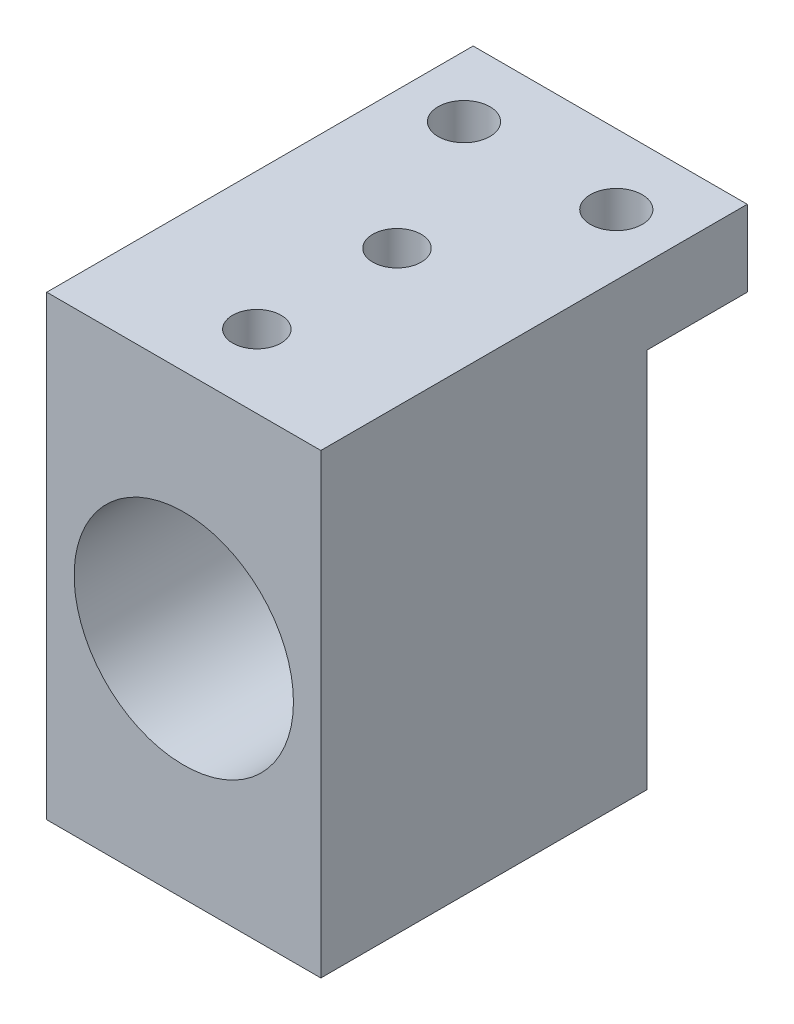
ISO-10303-21;
HEADER;
FILE_DESCRIPTION(('STEP AP214'),'2;1');
FILE_NAME('part.step','',(''),(''),'','','');
FILE_SCHEMA(('AUTOMOTIVE_DESIGN { 1 0 10303 214 1 1 1 1 }'));
ENDSEC;
DATA;
#1=APPLICATION_CONTEXT('core data for automotive mechanical design processes');
#2=APPLICATION_PROTOCOL_DEFINITION('international standard','automotive_design',2000,#1);
#3=PRODUCT_CONTEXT('',#1,'mechanical');
#4=PRODUCT('Part','Part','',(#3));
#5=PRODUCT_RELATED_PRODUCT_CATEGORY('part','',(#4));
#6=PRODUCT_DEFINITION_FORMATION('','',#4);
#7=PRODUCT_DEFINITION_CONTEXT('part definition',#1,'design');
#8=PRODUCT_DEFINITION('design','',#6,#7);
#9=PRODUCT_DEFINITION_SHAPE('','',#8);
#10=(LENGTH_UNIT() NAMED_UNIT(*) SI_UNIT(.MILLI.,.METRE.));
#11=(NAMED_UNIT(*) PLANE_ANGLE_UNIT() SI_UNIT($,.RADIAN.));
#12=(NAMED_UNIT(*) SI_UNIT($,.STERADIAN.) SOLID_ANGLE_UNIT());
#13=UNCERTAINTY_MEASURE_WITH_UNIT(LENGTH_MEASURE(1.E-05),#10,'distance_accuracy_value','');
#14=(GEOMETRIC_REPRESENTATION_CONTEXT(3) GLOBAL_UNCERTAINTY_ASSIGNED_CONTEXT((#13)) GLOBAL_UNIT_ASSIGNED_CONTEXT((#10,
#11,#12)) REPRESENTATION_CONTEXT('',''));
#15=CARTESIAN_POINT('',(0.,0.,0.));
#16=DIRECTION('',(0.,0.,1.));
#17=DIRECTION('',(1.,0.,0.));
#18=AXIS2_PLACEMENT_3D('',#15,#16,#17);
#19=CARTESIAN_POINT('',(-11.43,38.1,17.78));
#20=DIRECTION('',(1.,0.,0.));
#21=DIRECTION('',(0.,0.,-1.));
#22=AXIS2_PLACEMENT_3D('',#19,#20,#21);
#23=PLANE('',#22);
#24=DIRECTION('',(0.,0.,-1.));
#25=VECTOR('',#24,1.);
#26=CARTESIAN_POINT('',(-11.43,31.75,-17.78));
#27=LINE('',#26,#25);
#28=CARTESIAN_POINT('',(-11.43,31.75,-9.398));
#29=VERTEX_POINT('',#28);
#30=CARTESIAN_POINT('',(-11.43,31.75,-17.78));
#31=VERTEX_POINT('',#30);
#32=EDGE_CURVE('E97',#29,#31,#27,.T.);
#33=ORIENTED_EDGE('',*,*,#32,.F.);
#34=DIRECTION('',(0.,-1.,0.));
#35=VECTOR('',#34,1.);
#36=CARTESIAN_POINT('',(-11.43,31.75,-9.398));
#37=LINE('',#36,#35);
#38=CARTESIAN_POINT('',(-11.43,0.,-9.398));
#39=VERTEX_POINT('',#38);
#40=EDGE_CURVE('E137',#29,#39,#37,.T.);
#41=ORIENTED_EDGE('',*,*,#40,.T.);
#42=DIRECTION('',(0.,0.,1.));
#43=VECTOR('',#42,1.);
#44=CARTESIAN_POINT('',(-11.43,0.,17.78));
#45=LINE('',#44,#43);
#46=CARTESIAN_POINT('',(-11.43,0.,17.78));
#47=VERTEX_POINT('',#46);
#48=EDGE_CURVE('E136',#39,#47,#45,.T.);
#49=ORIENTED_EDGE('',*,*,#48,.T.);
#50=DIRECTION('',(0.,-1.,0.));
#51=VECTOR('',#50,1.);
#52=CARTESIAN_POINT('',(-11.43,38.1,17.78));
#53=LINE('',#52,#51);
#54=CARTESIAN_POINT('',(-11.43,38.1,17.78));
#55=VERTEX_POINT('',#54);
#56=EDGE_CURVE('E11',#55,#47,#53,.T.);
#57=ORIENTED_EDGE('',*,*,#56,.F.);
#58=DIRECTION('',(0.,0.,1.));
#59=VECTOR('',#58,1.);
#60=CARTESIAN_POINT('',(-11.43,38.1,17.78));
#61=LINE('',#60,#59);
#62=CARTESIAN_POINT('',(-11.43,38.1,-17.78));
#63=VERTEX_POINT('',#62);
#64=EDGE_CURVE('E118',#63,#55,#61,.T.);
#65=ORIENTED_EDGE('',*,*,#64,.F.);
#66=DIRECTION('',(0.,-1.,0.));
#67=VECTOR('',#66,1.);
#68=CARTESIAN_POINT('',(-11.43,38.1,-17.78));
#69=LINE('',#68,#67);
#70=EDGE_CURVE('E111',#63,#31,#69,.T.);
#71=ORIENTED_EDGE('',*,*,#70,.T.);
#72=EDGE_LOOP('',(#33,#41,#49,#57,#65,#71));
#73=FACE_BOUND('',#72,.T.);
#74=ADVANCED_FACE('F36',(#73),#23,.F.);
#75=CARTESIAN_POINT('',(11.43,38.1,17.78));
#76=DIRECTION('',(0.,0.,-1.));
#77=DIRECTION('',(-1.,0.,0.));
#78=AXIS2_PLACEMENT_3D('',#75,#76,#77);
#79=PLANE('',#78);
#80=CARTESIAN_POINT('',(0.,18.796,17.78));
#81=DIRECTION('',(0.,0.,1.));
#82=DIRECTION('',(1.,0.,0.));
#83=AXIS2_PLACEMENT_3D('',#80,#81,#82);
#84=CIRCLE('',#83,9.144);
#85=CARTESIAN_POINT('',(9.144,18.796,17.78));
#86=VERTEX_POINT('',#85);
#87=EDGE_CURVE('E159',#86,#86,#84,.T.);
#88=ORIENTED_EDGE('',*,*,#87,.F.);
#89=EDGE_LOOP('',(#88));
#90=FACE_BOUND('',#89,.T.);
#91=DIRECTION('',(1.,0.,0.));
#92=VECTOR('',#91,1.);
#93=CARTESIAN_POINT('',(11.43,0.,17.78));
#94=LINE('',#93,#92);
#95=CARTESIAN_POINT('',(11.43,0.,17.78));
#96=VERTEX_POINT('',#95);
#97=EDGE_CURVE('E75',#47,#96,#94,.T.);
#98=ORIENTED_EDGE('',*,*,#97,.T.);
#99=DIRECTION('',(0.,-1.,0.));
#100=VECTOR('',#99,1.);
#101=CARTESIAN_POINT('',(11.43,38.1,17.78));
#102=LINE('',#101,#100);
#103=CARTESIAN_POINT('',(11.43,38.1,17.78));
#104=VERTEX_POINT('',#103);
#105=EDGE_CURVE('E44',#104,#96,#102,.T.);
#106=ORIENTED_EDGE('',*,*,#105,.F.);
#107=DIRECTION('',(1.,0.,0.));
#108=VECTOR('',#107,1.);
#109=CARTESIAN_POINT('',(11.43,38.1,17.78));
#110=LINE('',#109,#108);
#111=EDGE_CURVE('E80',#55,#104,#110,.T.);
#112=ORIENTED_EDGE('',*,*,#111,.F.);
#113=ORIENTED_EDGE('',*,*,#56,.T.);
#114=EDGE_LOOP('',(#98,#106,#112,#113));
#115=FACE_BOUND('',#114,.T.);
#116=ADVANCED_FACE('F205',(#90,#115),#79,.F.);
#117=CARTESIAN_POINT('',(11.43,38.1,17.78));
#118=DIRECTION('',(-1.,0.,0.));
#119=DIRECTION('',(0.,0.,1.));
#120=AXIS2_PLACEMENT_3D('',#117,#118,#119);
#121=PLANE('',#120);
#122=DIRECTION('',(0.,0.,-1.));
#123=VECTOR('',#122,1.);
#124=CARTESIAN_POINT('',(11.43,0.,17.78));
#125=LINE('',#124,#123);
#126=CARTESIAN_POINT('',(11.43,0.,-9.39799999999999));
#127=VERTEX_POINT('',#126);
#128=EDGE_CURVE('E124',#96,#127,#125,.T.);
#129=ORIENTED_EDGE('',*,*,#128,.T.);
#130=DIRECTION('',(0.,-1.,0.));
#131=VECTOR('',#130,1.);
#132=CARTESIAN_POINT('',(11.43,31.75,-9.39799999999999));
#133=LINE('',#132,#131);
#134=CARTESIAN_POINT('',(11.43,31.75,-9.39799999999999));
#135=VERTEX_POINT('',#134);
#136=EDGE_CURVE('E51',#135,#127,#133,.T.);
#137=ORIENTED_EDGE('',*,*,#136,.F.);
#138=DIRECTION('',(0.,0.,1.));
#139=VECTOR('',#138,1.);
#140=CARTESIAN_POINT('',(11.43,31.75,-17.78));
#141=LINE('',#140,#139);
#142=CARTESIAN_POINT('',(11.43,31.75,-17.78));
#143=VERTEX_POINT('',#142);
#144=EDGE_CURVE('E115',#143,#135,#141,.T.);
#145=ORIENTED_EDGE('',*,*,#144,.F.);
#146=DIRECTION('',(0.,-1.,0.));
#147=VECTOR('',#146,1.);
#148=CARTESIAN_POINT('',(11.43,38.1,-17.78));
#149=LINE('',#148,#147);
#150=CARTESIAN_POINT('',(11.43,38.1,-17.78));
#151=VERTEX_POINT('',#150);
#152=EDGE_CURVE('E114',#151,#143,#149,.T.);
#153=ORIENTED_EDGE('',*,*,#152,.F.);
#154=DIRECTION('',(0.,0.,-1.));
#155=VECTOR('',#154,1.);
#156=CARTESIAN_POINT('',(11.43,38.1,17.78));
#157=LINE('',#156,#155);
#158=EDGE_CURVE('E121',#104,#151,#157,.T.);
#159=ORIENTED_EDGE('',*,*,#158,.F.);
#160=ORIENTED_EDGE('',*,*,#105,.T.);
#161=EDGE_LOOP('',(#129,#137,#145,#153,#159,#160));
#162=FACE_BOUND('',#161,.T.);
#163=ADVANCED_FACE('F131',(#162),#121,.F.);
#164=CARTESIAN_POINT('',(11.43,38.1,-17.78));
#165=DIRECTION('',(0.,0.,1.));
#166=DIRECTION('',(1.,0.,0.));
#167=AXIS2_PLACEMENT_3D('',#164,#165,#166);
#168=PLANE('',#167);
#169=ORIENTED_EDGE('',*,*,#152,.T.);
#170=DIRECTION('',(1.,0.,0.));
#171=VECTOR('',#170,1.);
#172=CARTESIAN_POINT('',(-11.43,31.75,-17.78));
#173=LINE('',#172,#171);
#174=EDGE_CURVE('E100',#31,#143,#173,.T.);
#175=ORIENTED_EDGE('',*,*,#174,.F.);
#176=ORIENTED_EDGE('',*,*,#70,.F.);
#177=DIRECTION('',(-1.,0.,0.));
#178=VECTOR('',#177,1.);
#179=CARTESIAN_POINT('',(11.43,38.1,-17.78));
#180=LINE('',#179,#178);
#181=EDGE_CURVE('E60',#151,#63,#180,.T.);
#182=ORIENTED_EDGE('',*,*,#181,.F.);
#183=EDGE_LOOP('',(#169,#175,#176,#182));
#184=FACE_BOUND('',#183,.T.);
#185=ADVANCED_FACE('F110',(#184),#168,.F.);
#186=CARTESIAN_POINT('',(0.,38.1,0.));
#187=DIRECTION('',(0.,1.,0.));
#188=DIRECTION('',(0.,0.,1.));
#189=AXIS2_PLACEMENT_3D('',#186,#187,#188);
#190=PLANE('',#189);
#191=CARTESIAN_POINT('',(0.,38.1,0.));
#192=DIRECTION('',(0.,1.,0.));
#193=DIRECTION('',(0.,0.,1.));
#194=AXIS2_PLACEMENT_3D('',#191,#192,#193);
#195=CIRCLE('',#194,2.01929999999999);
#196=CARTESIAN_POINT('',(0.,38.1,2.01929999999999));
#197=VERTEX_POINT('',#196);
#198=EDGE_CURVE('E190',#197,#197,#195,.T.);
#199=ORIENTED_EDGE('',*,*,#198,.F.);
#200=EDGE_LOOP('',(#199));
#201=FACE_BOUND('',#200,.T.);
#202=CARTESIAN_POINT('',(0.,38.1,11.6894741905998));
#203=DIRECTION('',(0.,1.,0.));
#204=DIRECTION('',(0.,0.,1.));
#205=AXIS2_PLACEMENT_3D('',#202,#203,#204);
#206=CIRCLE('',#205,2.01929999999999);
#207=CARTESIAN_POINT('',(0.,38.1,13.7087741905998));
#208=VERTEX_POINT('',#207);
#209=EDGE_CURVE('E170',#208,#208,#206,.T.);
#210=ORIENTED_EDGE('',*,*,#209,.F.);
#211=EDGE_LOOP('',(#210));
#212=FACE_BOUND('',#211,.T.);
#213=CARTESIAN_POINT('',(-6.35,38.1,-11.938));
#214=DIRECTION('',(0.,1.,0.));
#215=DIRECTION('',(0.,0.,1.));
#216=AXIS2_PLACEMENT_3D('',#213,#214,#215);
#217=CIRCLE('',#216,2.159);
#218=CARTESIAN_POINT('',(-6.35,38.1,-9.779));
#219=VERTEX_POINT('',#218);
#220=EDGE_CURVE('E154',#219,#219,#217,.T.);
#221=ORIENTED_EDGE('',*,*,#220,.F.);
#222=EDGE_LOOP('',(#221));
#223=FACE_BOUND('',#222,.T.);
#224=CARTESIAN_POINT('',(6.35,38.1,-11.938));
#225=DIRECTION('',(0.,1.,0.));
#226=DIRECTION('',(0.,0.,-1.));
#227=AXIS2_PLACEMENT_3D('',#224,#225,#226);
#228=CIRCLE('',#227,2.159);
#229=CARTESIAN_POINT('',(6.35,38.1,-14.097));
#230=VERTEX_POINT('',#229);
#231=EDGE_CURVE('E148',#230,#230,#228,.T.);
#232=ORIENTED_EDGE('',*,*,#231,.F.);
#233=EDGE_LOOP('',(#232));
#234=FACE_BOUND('',#233,.T.);
#235=ORIENTED_EDGE('',*,*,#64,.T.);
#236=ORIENTED_EDGE('',*,*,#111,.T.);
#237=ORIENTED_EDGE('',*,*,#158,.T.);
#238=ORIENTED_EDGE('',*,*,#181,.T.);
#239=EDGE_LOOP('',(#235,#236,#237,#238));
#240=FACE_BOUND('',#239,.T.);
#241=ADVANCED_FACE('F195',(#201,#212,#223,#234,#240),#190,.T.);
#242=CARTESIAN_POINT('',(0.,0.,0.));
#243=DIRECTION('',(0.,1.,0.));
#244=DIRECTION('',(0.,0.,1.));
#245=AXIS2_PLACEMENT_3D('',#242,#243,#244);
#246=PLANE('',#245);
#247=ORIENTED_EDGE('',*,*,#48,.F.);
#248=DIRECTION('',(-1.,0.,0.));
#249=VECTOR('',#248,1.);
#250=CARTESIAN_POINT('',(-11.43,0.,-9.398));
#251=LINE('',#250,#249);
#252=EDGE_CURVE('E106',#127,#39,#251,.T.);
#253=ORIENTED_EDGE('',*,*,#252,.F.);
#254=ORIENTED_EDGE('',*,*,#128,.F.);
#255=ORIENTED_EDGE('',*,*,#97,.F.);
#256=EDGE_LOOP('',(#247,#253,#254,#255));
#257=FACE_BOUND('',#256,.T.);
#258=ADVANCED_FACE('F134',(#257),#246,.F.);
#259=CARTESIAN_POINT('',(-11.43,31.75,-9.398));
#260=DIRECTION('',(0.,0.,1.));
#261=DIRECTION('',(1.,0.,0.));
#262=AXIS2_PLACEMENT_3D('',#259,#260,#261);
#263=PLANE('',#262);
#264=CARTESIAN_POINT('',(0.,18.796,-9.39799999999999));
#265=DIRECTION('',(0.,0.,1.));
#266=DIRECTION('',(1.,0.,0.));
#267=AXIS2_PLACEMENT_3D('',#264,#265,#266);
#268=CIRCLE('',#267,9.144);
#269=CARTESIAN_POINT('',(9.144,18.796,-9.39799999999999));
#270=VERTEX_POINT('',#269);
#271=EDGE_CURVE('E39',#270,#270,#268,.T.);
#272=ORIENTED_EDGE('',*,*,#271,.T.);
#273=EDGE_LOOP('',(#272));
#274=FACE_BOUND('',#273,.T.);
#275=ORIENTED_EDGE('',*,*,#252,.T.);
#276=ORIENTED_EDGE('',*,*,#40,.F.);
#277=DIRECTION('',(-1.,0.,0.));
#278=VECTOR('',#277,1.);
#279=CARTESIAN_POINT('',(-11.43,31.75,-9.398));
#280=LINE('',#279,#278);
#281=EDGE_CURVE('E102',#135,#29,#280,.T.);
#282=ORIENTED_EDGE('',*,*,#281,.F.);
#283=ORIENTED_EDGE('',*,*,#136,.T.);
#284=EDGE_LOOP('',(#275,#276,#282,#283));
#285=FACE_BOUND('',#284,.T.);
#286=ADVANCED_FACE('F218',(#274,#285),#263,.F.);
#287=CARTESIAN_POINT('',(0.,31.75,0.));
#288=DIRECTION('',(0.,1.,0.));
#289=DIRECTION('',(0.,0.,1.));
#290=AXIS2_PLACEMENT_3D('',#287,#288,#289);
#291=PLANE('',#290);
#292=CARTESIAN_POINT('',(-6.35,31.75,-11.938));
#293=DIRECTION('',(0.,1.,0.));
#294=DIRECTION('',(0.,0.,1.));
#295=AXIS2_PLACEMENT_3D('',#292,#293,#294);
#296=CIRCLE('',#295,2.159);
#297=CARTESIAN_POINT('',(-6.35,31.75,-9.779));
#298=VERTEX_POINT('',#297);
#299=EDGE_CURVE('E145',#298,#298,#296,.T.);
#300=ORIENTED_EDGE('',*,*,#299,.T.);
#301=EDGE_LOOP('',(#300));
#302=FACE_BOUND('',#301,.T.);
#303=CARTESIAN_POINT('',(6.35,31.75,-11.938));
#304=DIRECTION('',(0.,1.,0.));
#305=DIRECTION('',(0.,0.,-1.));
#306=AXIS2_PLACEMENT_3D('',#303,#304,#305);
#307=CIRCLE('',#306,2.159);
#308=CARTESIAN_POINT('',(6.35,31.75,-14.097));
#309=VERTEX_POINT('',#308);
#310=EDGE_CURVE('E151',#309,#309,#307,.T.);
#311=ORIENTED_EDGE('',*,*,#310,.T.);
#312=EDGE_LOOP('',(#311));
#313=FACE_BOUND('',#312,.T.);
#314=ORIENTED_EDGE('',*,*,#32,.T.);
#315=ORIENTED_EDGE('',*,*,#174,.T.);
#316=ORIENTED_EDGE('',*,*,#144,.T.);
#317=ORIENTED_EDGE('',*,*,#281,.T.);
#318=EDGE_LOOP('',(#314,#315,#316,#317));
#319=FACE_BOUND('',#318,.T.);
#320=ADVANCED_FACE('F99',(#302,#313,#319),#291,.F.);
#321=CARTESIAN_POINT('',(6.35,31.75,-11.938));
#322=DIRECTION('',(0.,1.,0.));
#323=DIRECTION('',(0.,0.,1.));
#324=AXIS2_PLACEMENT_3D('',#321,#322,#323);
#325=CYLINDRICAL_SURFACE('',#324,2.159);
#326=ORIENTED_EDGE('',*,*,#310,.F.);
#327=EDGE_LOOP('',(#326));
#328=FACE_BOUND('',#327,.T.);
#329=ORIENTED_EDGE('',*,*,#231,.T.);
#330=EDGE_LOOP('',(#329));
#331=FACE_BOUND('',#330,.T.);
#332=ADVANCED_FACE('F225',(#328,#331),#325,.F.);
#333=CARTESIAN_POINT('',(-6.35,31.75,-11.938));
#334=DIRECTION('',(0.,1.,0.));
#335=DIRECTION('',(0.,0.,1.));
#336=AXIS2_PLACEMENT_3D('',#333,#334,#335);
#337=CYLINDRICAL_SURFACE('',#336,2.159);
#338=ORIENTED_EDGE('',*,*,#299,.F.);
#339=EDGE_LOOP('',(#338));
#340=FACE_BOUND('',#339,.T.);
#341=ORIENTED_EDGE('',*,*,#220,.T.);
#342=EDGE_LOOP('',(#341));
#343=FACE_BOUND('',#342,.T.);
#344=ADVANCED_FACE('F229',(#340,#343),#337,.F.);
#345=CARTESIAN_POINT('',(0.,18.796,-17.78));
#346=DIRECTION('',(0.,0.,1.));
#347=DIRECTION('',(1.,0.,0.));
#348=AXIS2_PLACEMENT_3D('',#345,#346,#347);
#349=CYLINDRICAL_SURFACE('',#348,9.144);
#350=CARTESIAN_POINT('',(0.,27.94,2.01929999999999));
#351=CARTESIAN_POINT('',(0.111968514917693,27.9399979389035,2.01929621418386));
#352=CARTESIAN_POINT('',(0.22398254225839,27.9379225410807,2.00995572243882));
#353=CARTESIAN_POINT('',(0.444827050061163,27.9298438660368,1.97288041652883));
#354=CARTESIAN_POINT('',(0.553655229013896,27.9238378190067,1.94513263111525));
#355=CARTESIAN_POINT('',(0.76490461810418,27.9085663412848,1.87215566117278));
#356=CARTESIAN_POINT('',(0.86733245346457,27.8993043490417,1.82694491349101));
#357=CARTESIAN_POINT('',(1.06314555080707,27.8785197641214,1.72038431211964));
#358=CARTESIAN_POINT('',(1.15653101158984,27.8669972211602,1.65903481335799));
#359=CARTESIAN_POINT('',(1.33313759989042,27.8427425993395,1.52087757533875));
#360=CARTESIAN_POINT('',(1.41618984689284,27.8299952784797,1.44385661353387));
#361=CARTESIAN_POINT('',(1.56830788864068,27.8048348009282,1.27700046225541));
#362=CARTESIAN_POINT('',(1.63737241698043,27.7924216745814,1.18716411376938));
#363=CARTESIAN_POINT('',(1.76030274901305,27.7691845612409,0.995974679299958));
#364=CARTESIAN_POINT('',(1.81398818832152,27.7583800942368,0.894503038641087));
#365=CARTESIAN_POINT('',(1.9034792784355,27.7398026271193,0.683700241870185));
#366=CARTESIAN_POINT('',(1.93928711162396,27.7320292570145,0.574370046944756));
#367=CARTESIAN_POINT('',(1.99144725575846,27.7205494370761,0.352787225510583));
#368=CARTESIAN_POINT('',(2.00809887667615,27.7167804928154,0.240608363320027));
#369=CARTESIAN_POINT('',(2.02240469205696,27.7135486058908,0.014990821419608));
#370=CARTESIAN_POINT('',(2.02006126846075,27.7140851233306,-0.0984476985501769));
#371=CARTESIAN_POINT('',(1.996684252064,27.7193469871938,-0.321135037404961));
#372=CARTESIAN_POINT('',(1.97599891829067,27.7239942781141,-0.430422539832146));
#373=CARTESIAN_POINT('',(1.91707725103416,27.7368305842725,-0.643936757649846));
#374=CARTESIAN_POINT('',(1.8788399157938,27.7450198016599,-0.748163183810656));
#375=CARTESIAN_POINT('',(1.78558136533658,27.7640938227536,-0.949572796926258));
#376=CARTESIAN_POINT('',(1.73042672090788,27.7749999215968,-1.04669210154044));
#377=CARTESIAN_POINT('',(1.60499297548457,27.7982658695319,-1.23042568415152));
#378=CARTESIAN_POINT('',(1.53471177509951,27.8106259203074,-1.31703850135821));
#379=CARTESIAN_POINT('',(1.37917894519871,27.8357416178888,-1.47930496003606));
#380=CARTESIAN_POINT('',(1.29363131649125,27.8484999771909,-1.55467475051611));
#381=CARTESIAN_POINT('',(1.11096556067891,27.8727266434048,-1.69004462383783));
#382=CARTESIAN_POINT('',(1.01384721608786,27.8841949260603,-1.75004441771424));
#383=CARTESIAN_POINT('',(0.810446697472493,27.9045876386981,-1.8530433869954));
#384=CARTESIAN_POINT('',(0.704144799885901,27.9135064068416,-1.89600480504794));
#385=CARTESIAN_POINT('',(0.485589880121229,27.9277531780785,-1.96337614952729));
#386=CARTESIAN_POINT('',(0.373337743110945,27.933081713653,-1.98778882705733));
#387=CARTESIAN_POINT('',(0.148503050983134,27.9394716547134,-2.01695554185964));
#388=CARTESIAN_POINT('',(0.0359731095745489,27.9406171950715,-2.02209724352081));
#389=CARTESIAN_POINT('',(-0.188337850748175,27.9387480877108,-2.01362759173145));
#390=CARTESIAN_POINT('',(-0.300118920956252,27.9357337279133,-2.00001753615605));
#391=CARTESIAN_POINT('',(-0.518470652904948,27.9259366685216,-1.95475206261466));
#392=CARTESIAN_POINT('',(-0.625085654568677,27.9191965597761,-1.92330049497935));
#393=CARTESIAN_POINT('',(-0.831526477249874,27.9027026473288,-1.8434714728924));
#394=CARTESIAN_POINT('',(-0.931351711330755,27.8929485834908,-1.79509255738374));
#395=CARTESIAN_POINT('',(-1.12297850399816,27.871301513743,-1.68197803550924));
#396=CARTESIAN_POINT('',(-1.2146426815683,27.8593795355568,-1.61701536104969));
#397=CARTESIAN_POINT('',(-1.38590774221209,27.8347772834481,-1.47287581085458));
#398=CARTESIAN_POINT('',(-1.46550702352179,27.8220969091503,-1.39369705080116));
#399=CARTESIAN_POINT('',(-1.61191962528706,27.7971156211245,-1.2215925169085));
#400=CARTESIAN_POINT('',(-1.67846425880949,27.784826332629,-1.12843616315229));
#401=CARTESIAN_POINT('',(-1.79496594929387,27.7622906705589,-0.932042555403633));
#402=CARTESIAN_POINT('',(-1.84492372837182,27.7520442080567,-0.828805740521775));
#403=CARTESIAN_POINT('',(-1.92649307955932,27.7348533658871,-0.615737674013818));
#404=CARTESIAN_POINT('',(-1.95820850910044,27.7278903347076,-0.505947761754004));
#405=CARTESIAN_POINT('',(-2.00269561297703,27.7180219138443,-0.282423024892648));
#406=CARTESIAN_POINT('',(-2.01547038424141,27.7151158608212,-0.168688848318603));
#407=CARTESIAN_POINT('',(-2.02157976374295,27.7137328020539,0.0567853543305241));
#408=CARTESIAN_POINT('',(-2.01534058090129,27.7151586910544,0.168513446417934));
#409=CARTESIAN_POINT('',(-1.98455341922824,27.7220589322599,0.3892839610211));
#410=CARTESIAN_POINT('',(-1.96000566485537,27.7275332348324,0.498326416445162));
#411=CARTESIAN_POINT('',(-1.89350588884586,27.7418657035006,0.710283862699075));
#412=CARTESIAN_POINT('',(-1.85161703766428,27.7507115783907,0.81321955904523));
#413=CARTESIAN_POINT('',(-1.75167798487312,27.7707950793957,1.01066501550351));
#414=CARTESIAN_POINT('',(-1.69362606211515,27.7820329601968,1.10517387685595));
#415=CARTESIAN_POINT('',(-1.56160003562302,27.8059234858871,1.2851813637508));
#416=CARTESIAN_POINT('',(-1.48732268225564,27.8186004981038,1.37045437982264));
#417=CARTESIAN_POINT('',(-1.32556734494353,27.8437784046415,1.5274655044253));
#418=CARTESIAN_POINT('',(-1.23808631007604,27.8562792575262,1.5992004761299));
#419=CARTESIAN_POINT('',(-1.05100660877876,27.8798933303342,1.72801244708055));
#420=CARTESIAN_POINT('',(-0.951262447227834,27.8909859176876,1.78488213571442));
#421=CARTESIAN_POINT('',(-0.743406126923091,27.9103260543895,1.8809586155447));
#422=CARTESIAN_POINT('',(-0.635301010623651,27.9185759668524,1.92018008603426));
#423=CARTESIAN_POINT('',(-0.4392544961391,27.9298449592448,1.97292956860152));
#424=CARTESIAN_POINT('',(-0.352366510509366,27.9336293533917,1.99028503378836));
#425=CARTESIAN_POINT('',(-0.176995114482364,27.9387076311992,2.01347148104386));
#426=CARTESIAN_POINT('',(-0.0885117775900514,27.9400016293091,2.01930299271018));
#427=CARTESIAN_POINT('',(0.,27.94,2.01929999999999));
#428=B_SPLINE_CURVE_WITH_KNOTS('',3,(#350,#351,#352,#353,#354,#355,#356,#357,#358,#359,#360,
#361,#362,#363,#364,#365,#366,#367,#368,#369,#370,#371,#372,#373,#374,#375,#376,#377,#378,#379,
#380,#381,#382,#383,#384,#385,#386,#387,#388,#389,#390,#391,#392,#393,#394,#395,#396,#397,#398,
#399,#400,#401,#402,#403,#404,#405,#406,#407,#408,#409,#410,#411,#412,#413,#414,#415,#416,#417,
#418,#419,#420,#421,#422,#423,#424,#425,#426,#427),.UNSPECIFIED.,.T.,.F.,(4,2,2,2,2,2,2,2,2,2,2,
2,2,2,2,2,2,2,2,2,2,2,2,2,2,2,2,2,2,2,2,2,2,2,2,2,2,2,4),(0.,0.335581532987582,
0.671399795071434,1.00686447562267,1.34232177915717,1.68269172259464,2.02309246833347,
2.36733567904542,2.71153685648313,3.05028365373174,3.38898797346534,3.72139579933305,
4.05382259929553,4.38894182056886,4.72410758252797,5.06666578597543,5.40923042925201,
5.7525500162146,6.09581867292152,6.43214372070351,6.76844549141405,7.1009800403676,
7.43354329859356,7.77093023066396,8.10836191585486,8.45214110805423,8.79590533171241,
9.13769255380057,9.47942388514377,9.81355188261638,10.1476757838303,10.4805930959834,
10.8135458728921,11.1533547116694,11.4932421892859,11.8376434069379,12.1817576293622,
12.4470490209833,12.712328220524),.UNSPECIFIED.);
#429=CARTESIAN_POINT('',(0.,27.94,2.01929999999999));
#430=VERTEX_POINT('',#429);
#431=EDGE_CURVE('E184',#430,#430,#428,.T.);
#432=ORIENTED_EDGE('',*,*,#431,.T.);
#433=EDGE_LOOP('',(#432));
#434=FACE_BOUND('',#433,.T.);
#435=CARTESIAN_POINT('',(0.,27.94,13.7087741905998));
#436=CARTESIAN_POINT('',(0.111968514917693,27.9399979389035,13.7087704047836));
#437=CARTESIAN_POINT('',(0.22398254225839,27.9379225410807,13.6994299130386));
#438=CARTESIAN_POINT('',(0.444827050061164,27.9298438660368,13.6623546071286));
#439=CARTESIAN_POINT('',(0.553655229013897,27.9238378190067,13.634606821715));
#440=CARTESIAN_POINT('',(0.76490461810418,27.9085663412848,13.5616298517725));
#441=CARTESIAN_POINT('',(0.86733245346457,27.8993043490417,13.5164191040908));
#442=CARTESIAN_POINT('',(1.06314555080707,27.8785197641214,13.4098585027194));
#443=CARTESIAN_POINT('',(1.15653101158984,27.8669972211602,13.3485090039578));
#444=CARTESIAN_POINT('',(1.33313759989042,27.8427425993395,13.2103517659385));
#445=CARTESIAN_POINT('',(1.41618984689284,27.8299952784797,13.1333308041336));
#446=CARTESIAN_POINT('',(1.56830788864068,27.8048348009282,12.9664746528552));
#447=CARTESIAN_POINT('',(1.63737241698043,27.7924216745814,12.8766383043691));
#448=CARTESIAN_POINT('',(1.76030274901305,27.7691845612409,12.6854488698997));
#449=CARTESIAN_POINT('',(1.81398818832152,27.7583800942368,12.5839772292408));
#450=CARTESIAN_POINT('',(1.9034792784355,27.7398026271193,12.3731744324699));
#451=CARTESIAN_POINT('',(1.93928711162396,27.7320292570145,12.2638442375445));
#452=CARTESIAN_POINT('',(1.99144725575846,27.7205494370761,12.0422614161103));
#453=CARTESIAN_POINT('',(2.00809887667615,27.7167804928154,11.9300825539198));
#454=CARTESIAN_POINT('',(2.02240469205696,27.7135486058908,11.7044650120194));
#455=CARTESIAN_POINT('',(2.02006126846075,27.7140851233306,11.5910264920496));
#456=CARTESIAN_POINT('',(1.996684252064,27.7193469871938,11.3683391531948));
#457=CARTESIAN_POINT('',(1.97599891829067,27.7239942781141,11.2590516507676));
#458=CARTESIAN_POINT('',(1.91707725103416,27.7368305842725,11.0455374329499));
#459=CARTESIAN_POINT('',(1.8788399157938,27.7450198016599,10.9413110067891));
#460=CARTESIAN_POINT('',(1.78558136533658,27.7640938227536,10.7399013936735));
#461=CARTESIAN_POINT('',(1.73042672090788,27.7749999215968,10.6427820890593));
#462=CARTESIAN_POINT('',(1.60499297548456,27.7982658695319,10.4590485064482));
#463=CARTESIAN_POINT('',(1.53471177509951,27.8106259203074,10.3724356892415));
#464=CARTESIAN_POINT('',(1.37917894519871,27.8357416178888,10.2101692305637));
#465=CARTESIAN_POINT('',(1.29363131649125,27.8484999771909,10.1347994400836));
#466=CARTESIAN_POINT('',(1.11096556067891,27.8727266434048,9.99942956676193));
#467=CARTESIAN_POINT('',(1.01384721608785,27.8841949260603,9.93942977288552));
#468=CARTESIAN_POINT('',(0.810446697472492,27.9045876386981,9.83643080360436));
#469=CARTESIAN_POINT('',(0.7041447998859,27.9135064068416,9.79346938555182));
#470=CARTESIAN_POINT('',(0.485589880121228,27.9277531780785,9.72609804107247));
#471=CARTESIAN_POINT('',(0.373337743110944,27.933081713653,9.70168536354243));
#472=CARTESIAN_POINT('',(0.148503050983131,27.9394716547134,9.67251864874012));
#473=CARTESIAN_POINT('',(0.0359731095745465,27.9406171950715,9.66737694707895));
#474=CARTESIAN_POINT('',(-0.188337850748177,27.9387480877108,9.67584659886831));
#475=CARTESIAN_POINT('',(-0.300118920956254,27.9357337279133,9.68945665444371));
#476=CARTESIAN_POINT('',(-0.518470652904949,27.9259366685216,9.7347221279851));
#477=CARTESIAN_POINT('',(-0.625085654568679,27.9191965597761,9.76617369562041));
#478=CARTESIAN_POINT('',(-0.831526477249876,27.9027026473288,9.84600271770736));
#479=CARTESIAN_POINT('',(-0.931351711330757,27.8929485834908,9.89438163321602));
#480=CARTESIAN_POINT('',(-1.12297850399816,27.871301513743,10.0074961550905));
#481=CARTESIAN_POINT('',(-1.21464268156831,27.8593795355568,10.0724588295501));
#482=CARTESIAN_POINT('',(-1.38590774221209,27.8347772834481,10.2165983797452));
#483=CARTESIAN_POINT('',(-1.46550702352179,27.8220969091503,10.2957771397986));
#484=CARTESIAN_POINT('',(-1.61191962528706,27.7971156211245,10.4678816736913));
#485=CARTESIAN_POINT('',(-1.67846425880949,27.784826332629,10.5610380274475));
#486=CARTESIAN_POINT('',(-1.79496594929387,27.7622906705589,10.7574316351961));
#487=CARTESIAN_POINT('',(-1.84492372837182,27.7520442080567,10.860668450078));
#488=CARTESIAN_POINT('',(-1.92649307955932,27.7348533658871,11.0737365165859));
#489=CARTESIAN_POINT('',(-1.95820850910044,27.7278903347076,11.1835264288458));
#490=CARTESIAN_POINT('',(-2.00269561297703,27.7180219138443,11.4070511657071));
#491=CARTESIAN_POINT('',(-2.01547038424141,27.7151158608212,11.5207853422812));
#492=CARTESIAN_POINT('',(-2.02157976374295,27.7137328020539,11.7462595449303));
#493=CARTESIAN_POINT('',(-2.01534058090129,27.7151586910544,11.8579876370177));
#494=CARTESIAN_POINT('',(-1.98455341922824,27.7220589322599,12.0787581516209));
#495=CARTESIAN_POINT('',(-1.96000566485537,27.7275332348324,12.1878006070449));
#496=CARTESIAN_POINT('',(-1.89350588884586,27.7418657035006,12.3997580532988));
#497=CARTESIAN_POINT('',(-1.85161703766428,27.7507115783907,12.502693749645));
#498=CARTESIAN_POINT('',(-1.75167798487312,27.7707950793957,12.7001392061033));
#499=CARTESIAN_POINT('',(-1.69362606211515,27.7820329601968,12.7946480674557));
#500=CARTESIAN_POINT('',(-1.56160003562302,27.8059234858871,12.9746555543506));
#501=CARTESIAN_POINT('',(-1.48732268225564,27.8186004981038,13.0599285704224));
#502=CARTESIAN_POINT('',(-1.32556734494352,27.8437784046415,13.2169396950251));
#503=CARTESIAN_POINT('',(-1.23808631007604,27.8562792575262,13.2886746667297));
#504=CARTESIAN_POINT('',(-1.05100660877876,27.8798933303342,13.4174866376803));
#505=CARTESIAN_POINT('',(-0.951262447227833,27.8909859176876,13.4743563263142));
#506=CARTESIAN_POINT('',(-0.743406126923091,27.9103260543895,13.5704328061445));
#507=CARTESIAN_POINT('',(-0.635301010623651,27.9185759668524,13.609654276634));
#508=CARTESIAN_POINT('',(-0.439254496139099,27.9298449592448,13.6624037592013));
#509=CARTESIAN_POINT('',(-0.352366510509364,27.9336293533917,13.6797592243881));
#510=CARTESIAN_POINT('',(-0.176995114482362,27.9387076311992,13.7029456716436));
#511=CARTESIAN_POINT('',(-0.0885117775900506,27.9400016293091,13.7087771833099));
#512=CARTESIAN_POINT('',(0.,27.94,13.7087741905998));
#513=B_SPLINE_CURVE_WITH_KNOTS('',3,(#435,#436,#437,#438,#439,#440,#441,#442,#443,#444,#445,
#446,#447,#448,#449,#450,#451,#452,#453,#454,#455,#456,#457,#458,#459,#460,#461,#462,#463,#464,
#465,#466,#467,#468,#469,#470,#471,#472,#473,#474,#475,#476,#477,#478,#479,#480,#481,#482,#483,
#484,#485,#486,#487,#488,#489,#490,#491,#492,#493,#494,#495,#496,#497,#498,#499,#500,#501,#502,
#503,#504,#505,#506,#507,#508,#509,#510,#511,#512),.UNSPECIFIED.,.T.,.F.,(4,2,2,2,2,2,2,2,2,2,2,
2,2,2,2,2,2,2,2,2,2,2,2,2,2,2,2,2,2,2,2,2,2,2,2,2,2,2,4),(0.,0.335581532987582,
0.671399795071435,1.00686447562267,1.34232177915717,1.68269172259464,2.02309246833347,
2.36733567904542,2.71153685648313,3.05028365373174,3.38898797346535,3.72139579933305,
4.05382259929553,4.38894182056887,4.72410758252797,5.06666578597544,5.40923042925201,
5.7525500162146,6.09581867292152,6.43214372070351,6.76844549141405,7.1009800403676,
7.43354329859357,7.77093023066396,8.10836191585486,8.45214110805423,8.79590533171241,
9.13769255380057,9.47942388514377,9.81355188261638,10.1476757838303,10.4805930959834,
10.8135458728921,11.1533547116694,11.4932421892859,11.8376434069379,12.1817576293622,
12.4470490209833,12.712328220524),.UNSPECIFIED.);
#514=CARTESIAN_POINT('',(0.,27.94,13.7087741905998));
#515=VERTEX_POINT('',#514);
#516=EDGE_CURVE('E162',#515,#515,#513,.T.);
#517=ORIENTED_EDGE('',*,*,#516,.T.);
#518=EDGE_LOOP('',(#517));
#519=FACE_BOUND('',#518,.T.);
#520=ORIENTED_EDGE('',*,*,#87,.T.);
#521=EDGE_LOOP('',(#520));
#522=FACE_BOUND('',#521,.T.);
#523=ORIENTED_EDGE('',*,*,#271,.F.);
#524=EDGE_LOOP('',(#523));
#525=FACE_BOUND('',#524,.T.);
#526=ADVANCED_FACE('F179',(#434,#519,#522,#525),#349,.F.);
#527=CARTESIAN_POINT('',(0.,38.1,11.6894741905998));
#528=DIRECTION('',(0.,1.,0.));
#529=DIRECTION('',(0.,0.,1.));
#530=AXIS2_PLACEMENT_3D('',#527,#528,#529);
#531=CYLINDRICAL_SURFACE('',#530,2.01929999999999);
#532=ORIENTED_EDGE('',*,*,#516,.F.);
#533=EDGE_LOOP('',(#532));
#534=FACE_BOUND('',#533,.T.);
#535=ORIENTED_EDGE('',*,*,#209,.T.);
#536=EDGE_LOOP('',(#535));
#537=FACE_BOUND('',#536,.T.);
#538=ADVANCED_FACE('F174',(#534,#537),#531,.F.);
#539=CARTESIAN_POINT('',(0.,38.1,0.));
#540=DIRECTION('',(0.,1.,0.));
#541=DIRECTION('',(0.,0.,1.));
#542=AXIS2_PLACEMENT_3D('',#539,#540,#541);
#543=CYLINDRICAL_SURFACE('',#542,2.01929999999999);
#544=ORIENTED_EDGE('',*,*,#431,.F.);
#545=EDGE_LOOP('',(#544));
#546=FACE_BOUND('',#545,.T.);
#547=ORIENTED_EDGE('',*,*,#198,.T.);
#548=EDGE_LOOP('',(#547));
#549=FACE_BOUND('',#548,.T.);
#550=ADVANCED_FACE('F178',(#546,#549),#543,.F.);
#551=CLOSED_SHELL('',(#74,#116,#163,#185,#241,#258,#286,#320,#332,#344,#526,#538,#550));
#552=MANIFOLD_SOLID_BREP('B2',#551);
#553=ADVANCED_BREP_SHAPE_REPRESENTATION('',(#18,#552),#14);
#554=SHAPE_DEFINITION_REPRESENTATION(#9,#553);
ENDSEC;
END-ISO-10303-21;
